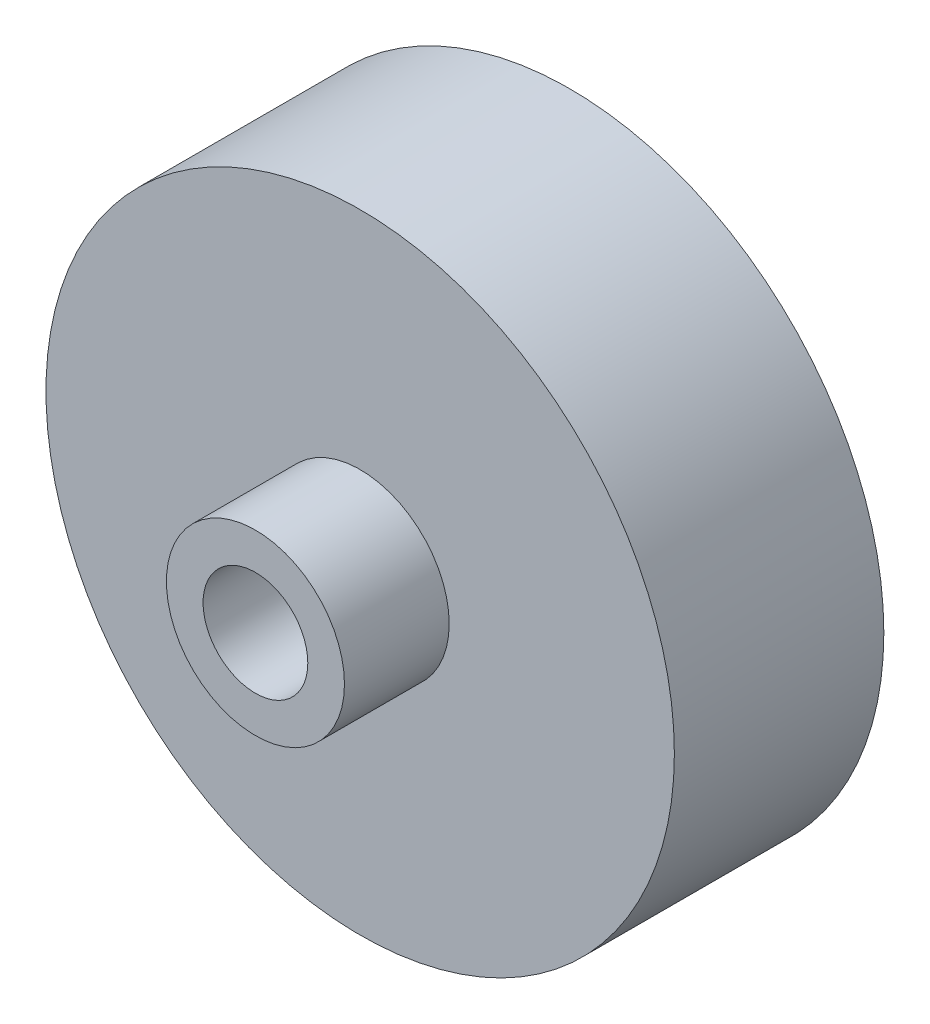
ISO-10303-21;
HEADER;
FILE_DESCRIPTION(('STEP AP214'),'2;1');
FILE_NAME('part.step','',(''),(''),'','','');
FILE_SCHEMA(('AUTOMOTIVE_DESIGN { 1 0 10303 214 1 1 1 1 }'));
ENDSEC;
DATA;
#1=APPLICATION_CONTEXT('core data for automotive mechanical design processes');
#2=APPLICATION_PROTOCOL_DEFINITION('international standard','automotive_design',2000,#1);
#3=PRODUCT_CONTEXT('',#1,'mechanical');
#4=PRODUCT('Part','Part','',(#3));
#5=PRODUCT_RELATED_PRODUCT_CATEGORY('part','',(#4));
#6=PRODUCT_DEFINITION_FORMATION('','',#4);
#7=PRODUCT_DEFINITION_CONTEXT('part definition',#1,'design');
#8=PRODUCT_DEFINITION('design','',#6,#7);
#9=PRODUCT_DEFINITION_SHAPE('','',#8);
#10=(LENGTH_UNIT() NAMED_UNIT(*) SI_UNIT(.MILLI.,.METRE.));
#11=(NAMED_UNIT(*) PLANE_ANGLE_UNIT() SI_UNIT($,.RADIAN.));
#12=(NAMED_UNIT(*) SI_UNIT($,.STERADIAN.) SOLID_ANGLE_UNIT());
#13=UNCERTAINTY_MEASURE_WITH_UNIT(LENGTH_MEASURE(1.E-05),#10,'distance_accuracy_value','');
#14=(GEOMETRIC_REPRESENTATION_CONTEXT(3) GLOBAL_UNCERTAINTY_ASSIGNED_CONTEXT((#13)) GLOBAL_UNIT_ASSIGNED_CONTEXT((#10,
#11,#12)) REPRESENTATION_CONTEXT('',''));
#15=CARTESIAN_POINT('',(0.,0.,0.));
#16=DIRECTION('',(0.,0.,1.));
#17=DIRECTION('',(1.,0.,0.));
#18=AXIS2_PLACEMENT_3D('',#15,#16,#17);
#19=CARTESIAN_POINT('',(0.,0.,20.));
#20=DIRECTION('',(0.,0.,1.));
#21=DIRECTION('',(1.,0.,0.));
#22=AXIS2_PLACEMENT_3D('',#19,#20,#21);
#23=PLANE('',#22);
#24=CARTESIAN_POINT('',(0.,0.,20.));
#25=DIRECTION('',(0.,0.,1.));
#26=DIRECTION('',(1.,0.,0.));
#27=AXIS2_PLACEMENT_3D('',#24,#25,#26);
#28=CIRCLE('',#27,30.);
#29=CARTESIAN_POINT('',(30.,0.,20.));
#30=VERTEX_POINT('',#29);
#31=EDGE_CURVE('E10',#30,#30,#28,.T.);
#32=ORIENTED_EDGE('',*,*,#31,.T.);
#33=EDGE_LOOP('',(#32));
#34=FACE_BOUND('',#33,.T.);
#35=CARTESIAN_POINT('',(0.,0.,20.));
#36=DIRECTION('',(0.,0.,1.));
#37=DIRECTION('',(1.,0.,0.));
#38=AXIS2_PLACEMENT_3D('',#35,#36,#37);
#39=CIRCLE('',#38,8.5);
#40=CARTESIAN_POINT('',(8.5,0.,20.));
#41=VERTEX_POINT('',#40);
#42=EDGE_CURVE('E62',#41,#41,#39,.T.);
#43=ORIENTED_EDGE('',*,*,#42,.F.);
#44=EDGE_LOOP('',(#43));
#45=FACE_BOUND('',#44,.T.);
#46=ADVANCED_FACE('F43',(#34,#45),#23,.T.);
#47=CARTESIAN_POINT('',(0.,0.,0.));
#48=DIRECTION('',(0.,0.,1.));
#49=DIRECTION('',(1.,0.,0.));
#50=AXIS2_PLACEMENT_3D('',#47,#48,#49);
#51=PLANE('',#50);
#52=CARTESIAN_POINT('',(0.,0.,0.));
#53=DIRECTION('',(0.,0.,1.));
#54=DIRECTION('',(1.,0.,0.));
#55=AXIS2_PLACEMENT_3D('',#52,#53,#54);
#56=CIRCLE('',#55,30.);
#57=CARTESIAN_POINT('',(30.,0.,0.));
#58=VERTEX_POINT('',#57);
#59=EDGE_CURVE('E47',#58,#58,#56,.T.);
#60=ORIENTED_EDGE('',*,*,#59,.F.);
#61=EDGE_LOOP('',(#60));
#62=FACE_BOUND('',#61,.T.);
#63=CARTESIAN_POINT('',(0.,0.,0.));
#64=DIRECTION('',(0.,0.,1.));
#65=DIRECTION('',(1.,0.,0.));
#66=AXIS2_PLACEMENT_3D('',#63,#64,#65);
#67=CIRCLE('',#66,5.);
#68=CARTESIAN_POINT('',(5.,0.,0.));
#69=VERTEX_POINT('',#68);
#70=EDGE_CURVE('E56',#69,#69,#67,.T.);
#71=ORIENTED_EDGE('',*,*,#70,.T.);
#72=EDGE_LOOP('',(#71));
#73=FACE_BOUND('',#72,.T.);
#74=ADVANCED_FACE('F90',(#62,#73),#51,.F.);
#75=CARTESIAN_POINT('',(0.,0.,20.));
#76=DIRECTION('',(0.,0.,-1.));
#77=DIRECTION('',(-1.,0.,0.));
#78=AXIS2_PLACEMENT_3D('',#75,#76,#77);
#79=CYLINDRICAL_SURFACE('',#78,30.);
#80=ORIENTED_EDGE('',*,*,#31,.F.);
#81=EDGE_LOOP('',(#80));
#82=FACE_BOUND('',#81,.T.);
#83=ORIENTED_EDGE('',*,*,#59,.T.);
#84=EDGE_LOOP('',(#83));
#85=FACE_BOUND('',#84,.T.);
#86=ADVANCED_FACE('F45',(#82,#85),#79,.T.);
#87=CARTESIAN_POINT('',(0.,0.,20.));
#88=DIRECTION('',(0.,0.,-1.));
#89=DIRECTION('',(-1.,0.,0.));
#90=AXIS2_PLACEMENT_3D('',#87,#88,#89);
#91=CYLINDRICAL_SURFACE('',#90,5.);
#92=ORIENTED_EDGE('',*,*,#70,.F.);
#93=EDGE_LOOP('',(#92));
#94=FACE_BOUND('',#93,.T.);
#95=CARTESIAN_POINT('',(0.,0.,30.));
#96=DIRECTION('',(0.,0.,1.));
#97=DIRECTION('',(1.,0.,0.));
#98=AXIS2_PLACEMENT_3D('',#95,#96,#97);
#99=CIRCLE('',#98,5.);
#100=CARTESIAN_POINT('',(5.,0.,30.));
#101=VERTEX_POINT('',#100);
#102=EDGE_CURVE('E66',#101,#101,#99,.T.);
#103=ORIENTED_EDGE('',*,*,#102,.T.);
#104=EDGE_LOOP('',(#103));
#105=FACE_BOUND('',#104,.T.);
#106=ADVANCED_FACE('F74',(#94,#105),#91,.F.);
#107=CARTESIAN_POINT('',(0.,0.,30.));
#108=DIRECTION('',(0.,0.,1.));
#109=DIRECTION('',(1.,0.,0.));
#110=AXIS2_PLACEMENT_3D('',#107,#108,#109);
#111=PLANE('',#110);
#112=CARTESIAN_POINT('',(0.,0.,30.));
#113=DIRECTION('',(0.,0.,1.));
#114=DIRECTION('',(1.,0.,0.));
#115=AXIS2_PLACEMENT_3D('',#112,#113,#114);
#116=CIRCLE('',#115,8.5);
#117=CARTESIAN_POINT('',(8.5,0.,30.));
#118=VERTEX_POINT('',#117);
#119=EDGE_CURVE('E61',#118,#118,#116,.T.);
#120=ORIENTED_EDGE('',*,*,#119,.T.);
#121=EDGE_LOOP('',(#120));
#122=FACE_BOUND('',#121,.T.);
#123=ORIENTED_EDGE('',*,*,#102,.F.);
#124=EDGE_LOOP('',(#123));
#125=FACE_BOUND('',#124,.T.);
#126=ADVANCED_FACE('F76',(#122,#125),#111,.T.);
#127=CARTESIAN_POINT('',(0.,0.,30.));
#128=DIRECTION('',(0.,0.,-1.));
#129=DIRECTION('',(-1.,0.,0.));
#130=AXIS2_PLACEMENT_3D('',#127,#128,#129);
#131=CYLINDRICAL_SURFACE('',#130,8.5);
#132=ORIENTED_EDGE('',*,*,#119,.F.);
#133=EDGE_LOOP('',(#132));
#134=FACE_BOUND('',#133,.T.);
#135=ORIENTED_EDGE('',*,*,#42,.T.);
#136=EDGE_LOOP('',(#135));
#137=FACE_BOUND('',#136,.T.);
#138=ADVANCED_FACE('F78',(#134,#137),#131,.T.);
#139=CLOSED_SHELL('',(#46,#74,#86,#106,#126,#138));
#140=MANIFOLD_SOLID_BREP('B2',#139);
#141=ADVANCED_BREP_SHAPE_REPRESENTATION('',(#18,#140),#14);
#142=SHAPE_DEFINITION_REPRESENTATION(#9,#141);
ENDSEC;
END-ISO-10303-21;
